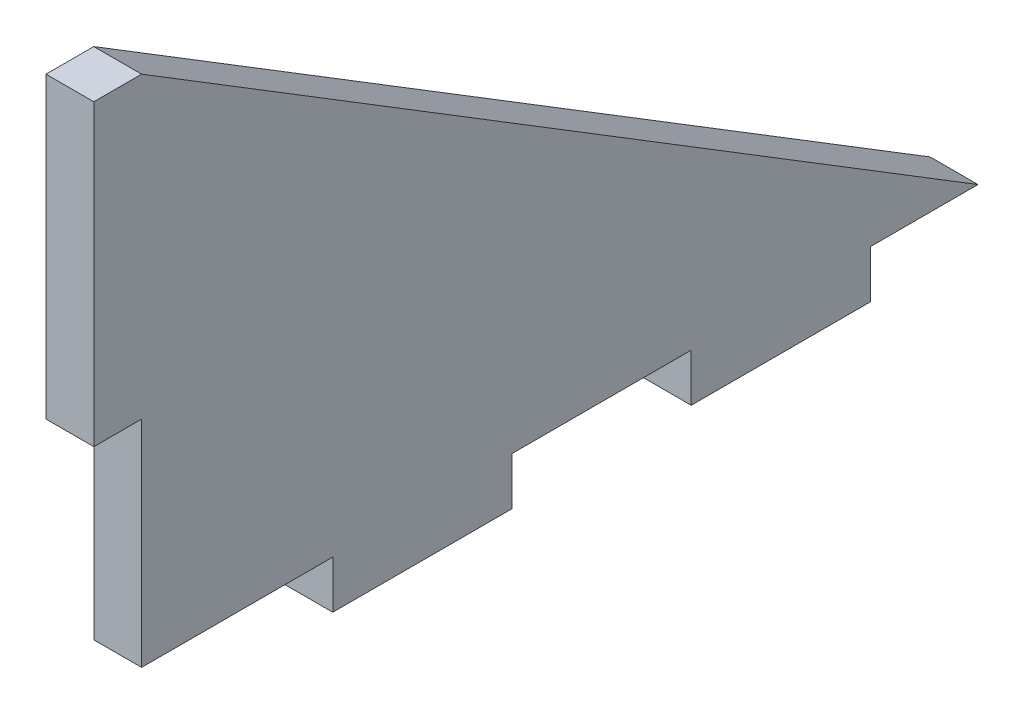
ISO-10303-21;
HEADER;
FILE_DESCRIPTION(('STEP AP214'),'2;1');
FILE_NAME('part.step','',(''),(''),'','','');
FILE_SCHEMA(('AUTOMOTIVE_DESIGN { 1 0 10303 214 1 1 1 1 }'));
ENDSEC;
DATA;
#1=APPLICATION_CONTEXT('core data for automotive mechanical design processes');
#2=APPLICATION_PROTOCOL_DEFINITION('international standard','automotive_design',2000,#1);
#3=PRODUCT_CONTEXT('',#1,'mechanical');
#4=PRODUCT('Part','Part','',(#3));
#5=PRODUCT_RELATED_PRODUCT_CATEGORY('part','',(#4));
#6=PRODUCT_DEFINITION_FORMATION('','',#4);
#7=PRODUCT_DEFINITION_CONTEXT('part definition',#1,'design');
#8=PRODUCT_DEFINITION('design','',#6,#7);
#9=PRODUCT_DEFINITION_SHAPE('','',#8);
#10=(LENGTH_UNIT() NAMED_UNIT(*) SI_UNIT(.MILLI.,.METRE.));
#11=(NAMED_UNIT(*) PLANE_ANGLE_UNIT() SI_UNIT($,.RADIAN.));
#12=(NAMED_UNIT(*) SI_UNIT($,.STERADIAN.) SOLID_ANGLE_UNIT());
#13=UNCERTAINTY_MEASURE_WITH_UNIT(LENGTH_MEASURE(1.E-05),#10,'distance_accuracy_value','');
#14=(GEOMETRIC_REPRESENTATION_CONTEXT(3) GLOBAL_UNCERTAINTY_ASSIGNED_CONTEXT((#13)) GLOBAL_UNIT_ASSIGNED_CONTEXT((#10,
#11,#12)) REPRESENTATION_CONTEXT('',''));
#15=CARTESIAN_POINT('',(0.,0.,0.));
#16=DIRECTION('',(0.,0.,1.));
#17=DIRECTION('',(1.,0.,0.));
#18=AXIS2_PLACEMENT_3D('',#15,#16,#17);
#19=CARTESIAN_POINT('',(4.,0.,0.));
#20=DIRECTION('',(0.,-1.,0.));
#21=DIRECTION('',(0.,0.,-1.));
#22=AXIS2_PLACEMENT_3D('',#19,#20,#21);
#23=PLANE('',#22);
#24=DIRECTION('',(0.,0.,1.));
#25=VECTOR('',#24,1.);
#26=CARTESIAN_POINT('',(0.,0.,0.));
#27=LINE('',#26,#25);
#28=CARTESIAN_POINT('',(0.,0.,-70.));
#29=VERTEX_POINT('',#28);
#30=CARTESIAN_POINT('',(0.,0.,-61.));
#31=VERTEX_POINT('',#30);
#32=EDGE_CURVE('E165',#29,#31,#27,.T.);
#33=ORIENTED_EDGE('',*,*,#32,.F.);
#34=DIRECTION('',(-1.,0.,0.));
#35=VECTOR('',#34,1.);
#36=CARTESIAN_POINT('',(4.,0.,-70.));
#37=LINE('',#36,#35);
#38=CARTESIAN_POINT('',(4.,0.,-70.));
#39=VERTEX_POINT('',#38);
#40=EDGE_CURVE('E11',#39,#29,#37,.T.);
#41=ORIENTED_EDGE('',*,*,#40,.F.);
#42=DIRECTION('',(0.,0.,1.));
#43=VECTOR('',#42,1.);
#44=CARTESIAN_POINT('',(4.,0.,0.));
#45=LINE('',#44,#43);
#46=CARTESIAN_POINT('',(4.,0.,-61.));
#47=VERTEX_POINT('',#46);
#48=EDGE_CURVE('E197',#39,#47,#45,.T.);
#49=ORIENTED_EDGE('',*,*,#48,.T.);
#50=DIRECTION('',(-1.,0.,0.));
#51=VECTOR('',#50,1.);
#52=CARTESIAN_POINT('',(4.,0.,-61.));
#53=LINE('',#52,#51);
#54=EDGE_CURVE('E52',#47,#31,#53,.T.);
#55=ORIENTED_EDGE('',*,*,#54,.T.);
#56=EDGE_LOOP('',(#33,#41,#49,#55));
#57=FACE_BOUND('',#56,.T.);
#58=ADVANCED_FACE('F35',(#57),#23,.T.);
#59=CARTESIAN_POINT('',(4.,31.2194399170247,-19.1776559490295));
#60=DIRECTION('',(0.,0.852075986307815,-0.523418105874801));
#61=DIRECTION('',(0.,0.523418105874801,0.852075986307815));
#62=AXIS2_PLACEMENT_3D('',#59,#60,#61);
#63=PLANE('',#62);
#64=DIRECTION('',(0.,-0.523418105874801,-0.852075986307815));
#65=VECTOR('',#64,1.);
#66=CARTESIAN_POINT('',(0.,31.2194399170247,-19.1776559490295));
#67=LINE('',#66,#65);
#68=CARTESIAN_POINT('',(0.,43.,0.));
#69=VERTEX_POINT('',#68);
#70=EDGE_CURVE('E167',#69,#29,#67,.T.);
#71=ORIENTED_EDGE('',*,*,#70,.F.);
#72=DIRECTION('',(-1.,0.,0.));
#73=VECTOR('',#72,1.);
#74=CARTESIAN_POINT('',(4.,43.,0.));
#75=LINE('',#74,#73);
#76=CARTESIAN_POINT('',(4.,43.,0.));
#77=VERTEX_POINT('',#76);
#78=EDGE_CURVE('E44',#77,#69,#75,.T.);
#79=ORIENTED_EDGE('',*,*,#78,.F.);
#80=DIRECTION('',(0.,-0.523418105874801,-0.852075986307815));
#81=VECTOR('',#80,1.);
#82=CARTESIAN_POINT('',(4.,31.2194399170247,-19.1776559490295));
#83=LINE('',#82,#81);
#84=EDGE_CURVE('E231',#77,#39,#83,.T.);
#85=ORIENTED_EDGE('',*,*,#84,.T.);
#86=ORIENTED_EDGE('',*,*,#40,.T.);
#87=EDGE_LOOP('',(#71,#79,#85,#86));
#88=FACE_BOUND('',#87,.T.);
#89=ADVANCED_FACE('F37',(#88),#63,.T.);
#90=CARTESIAN_POINT('',(4.,43.,0.));
#91=DIRECTION('',(0.,-1.,0.));
#92=DIRECTION('',(0.,0.,-1.));
#93=AXIS2_PLACEMENT_3D('',#90,#91,#92);
#94=PLANE('',#93);
#95=DIRECTION('',(0.,0.,1.));
#96=VECTOR('',#95,1.);
#97=CARTESIAN_POINT('',(0.,43.,0.));
#98=LINE('',#97,#96);
#99=CARTESIAN_POINT('',(0.,43.,4.));
#100=VERTEX_POINT('',#99);
#101=EDGE_CURVE('E172',#69,#100,#98,.T.);
#102=ORIENTED_EDGE('',*,*,#101,.T.);
#103=DIRECTION('',(-1.,0.,0.));
#104=VECTOR('',#103,1.);
#105=CARTESIAN_POINT('',(4.,43.,4.));
#106=LINE('',#105,#104);
#107=CARTESIAN_POINT('',(4.,43.,4.));
#108=VERTEX_POINT('',#107);
#109=EDGE_CURVE('E216',#108,#100,#106,.T.);
#110=ORIENTED_EDGE('',*,*,#109,.F.);
#111=DIRECTION('',(0.,0.,1.));
#112=VECTOR('',#111,1.);
#113=CARTESIAN_POINT('',(4.,43.,0.));
#114=LINE('',#113,#112);
#115=EDGE_CURVE('E223',#77,#108,#114,.T.);
#116=ORIENTED_EDGE('',*,*,#115,.F.);
#117=ORIENTED_EDGE('',*,*,#78,.T.);
#118=EDGE_LOOP('',(#102,#110,#116,#117));
#119=FACE_BOUND('',#118,.T.);
#120=ADVANCED_FACE('F221',(#119),#94,.F.);
#121=CARTESIAN_POINT('',(4.,0.,3.99999999999999));
#122=DIRECTION('',(0.,0.,-1.));
#123=DIRECTION('',(0.,1.,0.));
#124=AXIS2_PLACEMENT_3D('',#121,#122,#123);
#125=PLANE('',#124);
#126=DIRECTION('',(0.,-1.,0.));
#127=VECTOR('',#126,1.);
#128=CARTESIAN_POINT('',(0.,0.,3.99999999999999));
#129=LINE('',#128,#127);
#130=CARTESIAN_POINT('',(0.,18.,4.));
#131=VERTEX_POINT('',#130);
#132=EDGE_CURVE('E174',#100,#131,#129,.T.);
#133=ORIENTED_EDGE('',*,*,#132,.T.);
#134=DIRECTION('',(-1.,0.,0.));
#135=VECTOR('',#134,1.);
#136=CARTESIAN_POINT('',(4.,18.,4.));
#137=LINE('',#136,#135);
#138=CARTESIAN_POINT('',(4.,18.,4.));
#139=VERTEX_POINT('',#138);
#140=EDGE_CURVE('E214',#139,#131,#137,.T.);
#141=ORIENTED_EDGE('',*,*,#140,.F.);
#142=DIRECTION('',(0.,-1.,0.));
#143=VECTOR('',#142,1.);
#144=CARTESIAN_POINT('',(4.,0.,3.99999999999999));
#145=LINE('',#144,#143);
#146=EDGE_CURVE('E290',#108,#139,#145,.T.);
#147=ORIENTED_EDGE('',*,*,#146,.F.);
#148=ORIENTED_EDGE('',*,*,#109,.T.);
#149=EDGE_LOOP('',(#133,#141,#147,#148));
#150=FACE_BOUND('',#149,.T.);
#151=ADVANCED_FACE('F289',(#150),#125,.F.);
#152=CARTESIAN_POINT('',(4.,18.,0.));
#153=DIRECTION('',(0.,-1.,0.));
#154=DIRECTION('',(0.,0.,-1.));
#155=AXIS2_PLACEMENT_3D('',#152,#153,#154);
#156=PLANE('',#155);
#157=DIRECTION('',(0.,0.,1.));
#158=VECTOR('',#157,1.);
#159=CARTESIAN_POINT('',(0.,18.,0.));
#160=LINE('',#159,#158);
#161=CARTESIAN_POINT('',(0.,18.,0.));
#162=VERTEX_POINT('',#161);
#163=EDGE_CURVE('E177',#162,#131,#160,.T.);
#164=ORIENTED_EDGE('',*,*,#163,.F.);
#165=DIRECTION('',(-1.,0.,0.));
#166=VECTOR('',#165,1.);
#167=CARTESIAN_POINT('',(4.,18.,0.));
#168=LINE('',#167,#166);
#169=CARTESIAN_POINT('',(4.,18.,0.));
#170=VERTEX_POINT('',#169);
#171=EDGE_CURVE('E212',#170,#162,#168,.T.);
#172=ORIENTED_EDGE('',*,*,#171,.F.);
#173=DIRECTION('',(0.,0.,1.));
#174=VECTOR('',#173,1.);
#175=CARTESIAN_POINT('',(4.,18.,0.));
#176=LINE('',#175,#174);
#177=EDGE_CURVE('E286',#170,#139,#176,.T.);
#178=ORIENTED_EDGE('',*,*,#177,.T.);
#179=ORIENTED_EDGE('',*,*,#140,.T.);
#180=EDGE_LOOP('',(#164,#172,#178,#179));
#181=FACE_BOUND('',#180,.T.);
#182=ADVANCED_FACE('F284',(#181),#156,.T.);
#183=CARTESIAN_POINT('',(4.,0.,0.));
#184=DIRECTION('',(0.,0.,1.));
#185=DIRECTION('',(0.,-1.,0.));
#186=AXIS2_PLACEMENT_3D('',#183,#184,#185);
#187=PLANE('',#186);
#188=DIRECTION('',(0.,1.,0.));
#189=VECTOR('',#188,1.);
#190=CARTESIAN_POINT('',(0.,0.,0.));
#191=LINE('',#190,#189);
#192=CARTESIAN_POINT('',(0.,0.,0.));
#193=VERTEX_POINT('',#192);
#194=EDGE_CURVE('E180',#193,#162,#191,.T.);
#195=ORIENTED_EDGE('',*,*,#194,.F.);
#196=DIRECTION('',(-1.,0.,0.));
#197=VECTOR('',#196,1.);
#198=CARTESIAN_POINT('',(4.,0.,0.));
#199=LINE('',#198,#197);
#200=CARTESIAN_POINT('',(4.,0.,0.));
#201=VERTEX_POINT('',#200);
#202=EDGE_CURVE('E210',#201,#193,#199,.T.);
#203=ORIENTED_EDGE('',*,*,#202,.F.);
#204=DIRECTION('',(0.,1.,0.));
#205=VECTOR('',#204,1.);
#206=CARTESIAN_POINT('',(4.,0.,0.));
#207=LINE('',#206,#205);
#208=EDGE_CURVE('E280',#201,#170,#207,.T.);
#209=ORIENTED_EDGE('',*,*,#208,.T.);
#210=ORIENTED_EDGE('',*,*,#171,.T.);
#211=EDGE_LOOP('',(#195,#203,#209,#210));
#212=FACE_BOUND('',#211,.T.);
#213=ADVANCED_FACE('F253',(#212),#187,.T.);
#214=CARTESIAN_POINT('',(0.,0.,-16.));
#215=VERTEX_POINT('',#214);
#216=EDGE_CURVE('E169',#215,#193,#27,.T.);
#217=ORIENTED_EDGE('',*,*,#216,.F.);
#218=DIRECTION('',(-1.,0.,0.));
#219=VECTOR('',#218,1.);
#220=CARTESIAN_POINT('',(4.,0.,-16.));
#221=LINE('',#220,#219);
#222=CARTESIAN_POINT('',(4.,0.,-16.));
#223=VERTEX_POINT('',#222);
#224=EDGE_CURVE('E208',#223,#215,#221,.T.);
#225=ORIENTED_EDGE('',*,*,#224,.F.);
#226=EDGE_CURVE('E275',#223,#201,#45,.T.);
#227=ORIENTED_EDGE('',*,*,#226,.T.);
#228=ORIENTED_EDGE('',*,*,#202,.T.);
#229=EDGE_LOOP('',(#217,#225,#227,#228));
#230=FACE_BOUND('',#229,.T.);
#231=ADVANCED_FACE('F244',(#230),#23,.T.);
#232=CARTESIAN_POINT('',(4.,0.,-16.));
#233=DIRECTION('',(0.,0.,-1.));
#234=DIRECTION('',(-1.,0.,0.));
#235=AXIS2_PLACEMENT_3D('',#232,#233,#234);
#236=PLANE('',#235);
#237=DIRECTION('',(0.,-1.,0.));
#238=VECTOR('',#237,1.);
#239=CARTESIAN_POINT('',(0.,0.,-16.));
#240=LINE('',#239,#238);
#241=CARTESIAN_POINT('',(0.,-4.00000000000001,-16.));
#242=VERTEX_POINT('',#241);
#243=EDGE_CURVE('E183',#215,#242,#240,.T.);
#244=ORIENTED_EDGE('',*,*,#243,.T.);
#245=DIRECTION('',(-1.,0.,0.));
#246=VECTOR('',#245,1.);
#247=CARTESIAN_POINT('',(4.,-4.00000000000001,-16.));
#248=LINE('',#247,#246);
#249=CARTESIAN_POINT('',(4.,-4.00000000000001,-16.));
#250=VERTEX_POINT('',#249);
#251=EDGE_CURVE('E205',#250,#242,#248,.T.);
#252=ORIENTED_EDGE('',*,*,#251,.F.);
#253=DIRECTION('',(0.,-1.,0.));
#254=VECTOR('',#253,1.);
#255=CARTESIAN_POINT('',(4.,0.,-16.));
#256=LINE('',#255,#254);
#257=EDGE_CURVE('E297',#223,#250,#256,.T.);
#258=ORIENTED_EDGE('',*,*,#257,.F.);
#259=ORIENTED_EDGE('',*,*,#224,.T.);
#260=EDGE_LOOP('',(#244,#252,#258,#259));
#261=FACE_BOUND('',#260,.T.);
#262=ADVANCED_FACE('F252',(#261),#236,.F.);
#263=CARTESIAN_POINT('',(4.,-4.00000000000002,0.));
#264=DIRECTION('',(0.,1.,0.));
#265=DIRECTION('',(0.,0.,1.));
#266=AXIS2_PLACEMENT_3D('',#263,#264,#265);
#267=PLANE('',#266);
#268=DIRECTION('',(0.,0.,-1.));
#269=VECTOR('',#268,1.);
#270=CARTESIAN_POINT('',(0.,-4.00000000000002,0.));
#271=LINE('',#270,#269);
#272=CARTESIAN_POINT('',(0.,-4.,-31.));
#273=VERTEX_POINT('',#272);
#274=EDGE_CURVE('E185',#242,#273,#271,.T.);
#275=ORIENTED_EDGE('',*,*,#274,.T.);
#276=DIRECTION('',(-1.,0.,0.));
#277=VECTOR('',#276,1.);
#278=CARTESIAN_POINT('',(4.,-4.,-31.));
#279=LINE('',#278,#277);
#280=CARTESIAN_POINT('',(4.,-4.,-31.));
#281=VERTEX_POINT('',#280);
#282=EDGE_CURVE('E203',#281,#273,#279,.T.);
#283=ORIENTED_EDGE('',*,*,#282,.F.);
#284=DIRECTION('',(0.,0.,-1.));
#285=VECTOR('',#284,1.);
#286=CARTESIAN_POINT('',(4.,-4.00000000000002,0.));
#287=LINE('',#286,#285);
#288=EDGE_CURVE('E299',#250,#281,#287,.T.);
#289=ORIENTED_EDGE('',*,*,#288,.F.);
#290=ORIENTED_EDGE('',*,*,#251,.T.);
#291=EDGE_LOOP('',(#275,#283,#289,#290));
#292=FACE_BOUND('',#291,.T.);
#293=ADVANCED_FACE('F262',(#292),#267,.F.);
#294=CARTESIAN_POINT('',(4.,0.,-31.));
#295=DIRECTION('',(0.,0.,-1.));
#296=DIRECTION('',(-1.,0.,0.));
#297=AXIS2_PLACEMENT_3D('',#294,#295,#296);
#298=PLANE('',#297);
#299=DIRECTION('',(0.,-1.,0.));
#300=VECTOR('',#299,1.);
#301=CARTESIAN_POINT('',(0.,0.,-31.));
#302=LINE('',#301,#300);
#303=CARTESIAN_POINT('',(0.,0.,-31.));
#304=VERTEX_POINT('',#303);
#305=EDGE_CURVE('E188',#304,#273,#302,.T.);
#306=ORIENTED_EDGE('',*,*,#305,.F.);
#307=DIRECTION('',(-1.,0.,0.));
#308=VECTOR('',#307,1.);
#309=CARTESIAN_POINT('',(4.,0.,-31.));
#310=LINE('',#309,#308);
#311=CARTESIAN_POINT('',(4.,0.,-31.));
#312=VERTEX_POINT('',#311);
#313=EDGE_CURVE('E201',#312,#304,#310,.T.);
#314=ORIENTED_EDGE('',*,*,#313,.F.);
#315=DIRECTION('',(0.,-1.,0.));
#316=VECTOR('',#315,1.);
#317=CARTESIAN_POINT('',(4.,0.,-31.));
#318=LINE('',#317,#316);
#319=EDGE_CURVE('E300',#312,#281,#318,.T.);
#320=ORIENTED_EDGE('',*,*,#319,.T.);
#321=ORIENTED_EDGE('',*,*,#282,.T.);
#322=EDGE_LOOP('',(#306,#314,#320,#321));
#323=FACE_BOUND('',#322,.T.);
#324=ADVANCED_FACE('F256',(#323),#298,.T.);
#325=CARTESIAN_POINT('',(0.,0.,-46.));
#326=VERTEX_POINT('',#325);
#327=EDGE_CURVE('E168',#326,#304,#27,.T.);
#328=ORIENTED_EDGE('',*,*,#327,.F.);
#329=DIRECTION('',(-1.,0.,0.));
#330=VECTOR('',#329,1.);
#331=CARTESIAN_POINT('',(4.,0.,-46.));
#332=LINE('',#331,#330);
#333=CARTESIAN_POINT('',(4.,0.,-46.));
#334=VERTEX_POINT('',#333);
#335=EDGE_CURVE('E157',#334,#326,#332,.T.);
#336=ORIENTED_EDGE('',*,*,#335,.F.);
#337=EDGE_CURVE('E147',#334,#312,#45,.T.);
#338=ORIENTED_EDGE('',*,*,#337,.T.);
#339=ORIENTED_EDGE('',*,*,#313,.T.);
#340=EDGE_LOOP('',(#328,#336,#338,#339));
#341=FACE_BOUND('',#340,.T.);
#342=ADVANCED_FACE('F245',(#341),#23,.T.);
#343=CARTESIAN_POINT('',(4.,0.,-46.));
#344=DIRECTION('',(0.,0.,-1.));
#345=DIRECTION('',(-1.,0.,0.));
#346=AXIS2_PLACEMENT_3D('',#343,#344,#345);
#347=PLANE('',#346);
#348=DIRECTION('',(0.,-1.,0.));
#349=VECTOR('',#348,1.);
#350=CARTESIAN_POINT('',(0.,0.,-46.));
#351=LINE('',#350,#349);
#352=CARTESIAN_POINT('',(0.,-4.00000000000006,-46.));
#353=VERTEX_POINT('',#352);
#354=EDGE_CURVE('E154',#326,#353,#351,.T.);
#355=ORIENTED_EDGE('',*,*,#354,.T.);
#356=DIRECTION('',(-1.,0.,0.));
#357=VECTOR('',#356,1.);
#358=CARTESIAN_POINT('',(4.,-4.00000000000006,-46.));
#359=LINE('',#358,#357);
#360=CARTESIAN_POINT('',(4.,-4.00000000000006,-46.));
#361=VERTEX_POINT('',#360);
#362=EDGE_CURVE('E151',#361,#353,#359,.T.);
#363=ORIENTED_EDGE('',*,*,#362,.F.);
#364=DIRECTION('',(0.,-1.,0.));
#365=VECTOR('',#364,1.);
#366=CARTESIAN_POINT('',(4.,0.,-46.));
#367=LINE('',#366,#365);
#368=EDGE_CURVE('E139',#334,#361,#367,.T.);
#369=ORIENTED_EDGE('',*,*,#368,.F.);
#370=ORIENTED_EDGE('',*,*,#335,.T.);
#371=EDGE_LOOP('',(#355,#363,#369,#370));
#372=FACE_BOUND('',#371,.T.);
#373=ADVANCED_FACE('F152',(#372),#347,.F.);
#374=CARTESIAN_POINT('',(4.,-4.00000000000007,0.));
#375=DIRECTION('',(0.,1.,0.));
#376=DIRECTION('',(0.,0.,1.));
#377=AXIS2_PLACEMENT_3D('',#374,#375,#376);
#378=PLANE('',#377);
#379=DIRECTION('',(0.,0.,-1.));
#380=VECTOR('',#379,1.);
#381=CARTESIAN_POINT('',(0.,-4.00000000000007,0.));
#382=LINE('',#381,#380);
#383=CARTESIAN_POINT('',(0.,-4.00000000000006,-61.));
#384=VERTEX_POINT('',#383);
#385=EDGE_CURVE('E192',#353,#384,#382,.T.);
#386=ORIENTED_EDGE('',*,*,#385,.T.);
#387=DIRECTION('',(-1.,0.,0.));
#388=VECTOR('',#387,1.);
#389=CARTESIAN_POINT('',(4.,-4.00000000000006,-61.));
#390=LINE('',#389,#388);
#391=CARTESIAN_POINT('',(4.,-4.00000000000006,-61.));
#392=VERTEX_POINT('',#391);
#393=EDGE_CURVE('E96',#392,#384,#390,.T.);
#394=ORIENTED_EDGE('',*,*,#393,.F.);
#395=DIRECTION('',(0.,0.,-1.));
#396=VECTOR('',#395,1.);
#397=CARTESIAN_POINT('',(4.,-4.00000000000007,0.));
#398=LINE('',#397,#396);
#399=EDGE_CURVE('E144',#361,#392,#398,.T.);
#400=ORIENTED_EDGE('',*,*,#399,.F.);
#401=ORIENTED_EDGE('',*,*,#362,.T.);
#402=EDGE_LOOP('',(#386,#394,#400,#401));
#403=FACE_BOUND('',#402,.T.);
#404=ADVANCED_FACE('F159',(#403),#378,.F.);
#405=CARTESIAN_POINT('',(4.,0.,-61.));
#406=DIRECTION('',(0.,0.,-1.));
#407=DIRECTION('',(-1.,0.,0.));
#408=AXIS2_PLACEMENT_3D('',#405,#406,#407);
#409=PLANE('',#408);
#410=DIRECTION('',(0.,-1.,0.));
#411=VECTOR('',#410,1.);
#412=CARTESIAN_POINT('',(0.,0.,-61.));
#413=LINE('',#412,#411);
#414=EDGE_CURVE('E194',#31,#384,#413,.T.);
#415=ORIENTED_EDGE('',*,*,#414,.F.);
#416=ORIENTED_EDGE('',*,*,#54,.F.);
#417=DIRECTION('',(0.,-1.,0.));
#418=VECTOR('',#417,1.);
#419=CARTESIAN_POINT('',(4.,0.,-61.));
#420=LINE('',#419,#418);
#421=EDGE_CURVE('E160',#47,#392,#420,.T.);
#422=ORIENTED_EDGE('',*,*,#421,.T.);
#423=ORIENTED_EDGE('',*,*,#393,.T.);
#424=EDGE_LOOP('',(#415,#416,#422,#423));
#425=FACE_BOUND('',#424,.T.);
#426=ADVANCED_FACE('F232',(#425),#409,.T.);
#427=CARTESIAN_POINT('',(4.,0.,0.));
#428=DIRECTION('',(1.,0.,0.));
#429=DIRECTION('',(0.,0.,-1.));
#430=AXIS2_PLACEMENT_3D('',#427,#428,#429);
#431=PLANE('',#430);
#432=ORIENTED_EDGE('',*,*,#48,.F.);
#433=ORIENTED_EDGE('',*,*,#84,.F.);
#434=ORIENTED_EDGE('',*,*,#115,.T.);
#435=ORIENTED_EDGE('',*,*,#146,.T.);
#436=ORIENTED_EDGE('',*,*,#177,.F.);
#437=ORIENTED_EDGE('',*,*,#208,.F.);
#438=ORIENTED_EDGE('',*,*,#226,.F.);
#439=ORIENTED_EDGE('',*,*,#257,.T.);
#440=ORIENTED_EDGE('',*,*,#288,.T.);
#441=ORIENTED_EDGE('',*,*,#319,.F.);
#442=ORIENTED_EDGE('',*,*,#337,.F.);
#443=ORIENTED_EDGE('',*,*,#368,.T.);
#444=ORIENTED_EDGE('',*,*,#399,.T.);
#445=ORIENTED_EDGE('',*,*,#421,.F.);
#446=EDGE_LOOP('',(#432,#433,#434,#435,#436,#437,#438,#439,#440,#441,#442,#443,#444,#445));
#447=FACE_BOUND('',#446,.T.);
#448=ADVANCED_FACE('F141',(#447),#431,.T.);
#449=CARTESIAN_POINT('',(0.,0.,0.));
#450=DIRECTION('',(1.,0.,0.));
#451=DIRECTION('',(0.,0.,-1.));
#452=AXIS2_PLACEMENT_3D('',#449,#450,#451);
#453=PLANE('',#452);
#454=ORIENTED_EDGE('',*,*,#32,.T.);
#455=ORIENTED_EDGE('',*,*,#414,.T.);
#456=ORIENTED_EDGE('',*,*,#385,.F.);
#457=ORIENTED_EDGE('',*,*,#354,.F.);
#458=ORIENTED_EDGE('',*,*,#327,.T.);
#459=ORIENTED_EDGE('',*,*,#305,.T.);
#460=ORIENTED_EDGE('',*,*,#274,.F.);
#461=ORIENTED_EDGE('',*,*,#243,.F.);
#462=ORIENTED_EDGE('',*,*,#216,.T.);
#463=ORIENTED_EDGE('',*,*,#194,.T.);
#464=ORIENTED_EDGE('',*,*,#163,.T.);
#465=ORIENTED_EDGE('',*,*,#132,.F.);
#466=ORIENTED_EDGE('',*,*,#101,.F.);
#467=ORIENTED_EDGE('',*,*,#70,.T.);
#468=EDGE_LOOP('',(#454,#455,#456,#457,#458,#459,#460,#461,#462,#463,#464,#465,#466,#467));
#469=FACE_BOUND('',#468,.T.);
#470=ADVANCED_FACE('F230',(#469),#453,.F.);
#471=CLOSED_SHELL('',(#58,#89,#120,#151,#182,#213,#231,#262,#293,#324,#342,#373,#404,#426,#448,#470));
#472=MANIFOLD_SOLID_BREP('B2',#471);
#473=ADVANCED_BREP_SHAPE_REPRESENTATION('',(#18,#472),#14);
#474=SHAPE_DEFINITION_REPRESENTATION(#9,#473);
ENDSEC;
END-ISO-10303-21;
